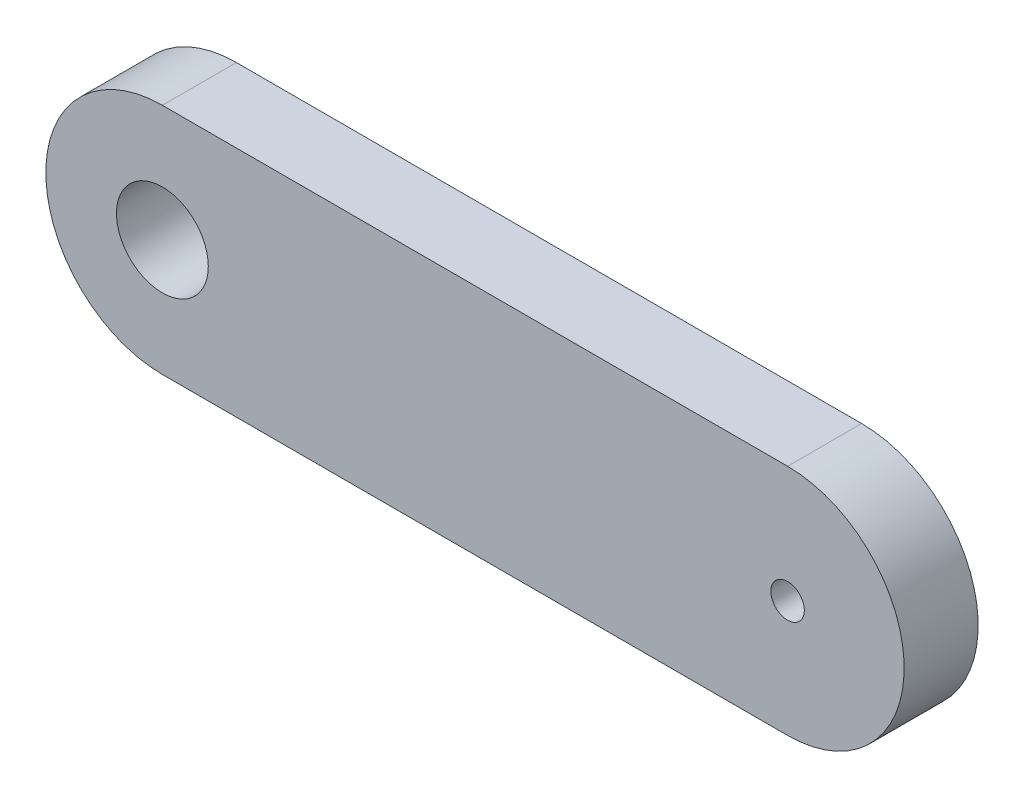
ISO-10303-21;
HEADER;
FILE_DESCRIPTION(('STEP AP214'),'2;1');
FILE_NAME('part.step','',(''),(''),'','','');
FILE_SCHEMA(('AUTOMOTIVE_DESIGN { 1 0 10303 214 1 1 1 1 }'));
ENDSEC;
DATA;
#1=APPLICATION_CONTEXT('core data for automotive mechanical design processes');
#2=APPLICATION_PROTOCOL_DEFINITION('international standard','automotive_design',2000,#1);
#3=PRODUCT_CONTEXT('',#1,'mechanical');
#4=PRODUCT('Part','Part','',(#3));
#5=PRODUCT_RELATED_PRODUCT_CATEGORY('part','',(#4));
#6=PRODUCT_DEFINITION_FORMATION('','',#4);
#7=PRODUCT_DEFINITION_CONTEXT('part definition',#1,'design');
#8=PRODUCT_DEFINITION('design','',#6,#7);
#9=PRODUCT_DEFINITION_SHAPE('','',#8);
#10=(LENGTH_UNIT() NAMED_UNIT(*) SI_UNIT(.MILLI.,.METRE.));
#11=(NAMED_UNIT(*) PLANE_ANGLE_UNIT() SI_UNIT($,.RADIAN.));
#12=(NAMED_UNIT(*) SI_UNIT($,.STERADIAN.) SOLID_ANGLE_UNIT());
#13=UNCERTAINTY_MEASURE_WITH_UNIT(LENGTH_MEASURE(1.E-05),#10,'distance_accuracy_value','');
#14=(GEOMETRIC_REPRESENTATION_CONTEXT(3) GLOBAL_UNCERTAINTY_ASSIGNED_CONTEXT((#13)) GLOBAL_UNIT_ASSIGNED_CONTEXT((#10,
#11,#12)) REPRESENTATION_CONTEXT('',''));
#15=CARTESIAN_POINT('',(0.,0.,0.));
#16=DIRECTION('',(0.,0.,1.));
#17=DIRECTION('',(1.,0.,0.));
#18=AXIS2_PLACEMENT_3D('',#15,#16,#17);
#19=CARTESIAN_POINT('',(-26.81729841,0.,6.35));
#20=DIRECTION('',(0.,0.,1.));
#21=DIRECTION('',(1.,0.,0.));
#22=AXIS2_PLACEMENT_3D('',#19,#20,#21);
#23=PLANE('',#22);
#24=CARTESIAN_POINT('',(-26.81729841,0.,6.35));
#25=DIRECTION('',(0.,0.,1.));
#26=DIRECTION('',(1.,0.,0.));
#27=AXIS2_PLACEMENT_3D('',#24,#25,#26);
#28=CIRCLE('',#27,3.9375);
#29=CARTESIAN_POINT('',(-22.87979841,0.,6.35));
#30=VERTEX_POINT('',#29);
#31=EDGE_CURVE('E125',#30,#30,#28,.T.);
#32=ORIENTED_EDGE('',*,*,#31,.F.);
#33=EDGE_LOOP('',(#32));
#34=FACE_BOUND('',#33,.T.);
#35=CARTESIAN_POINT('',(-26.81729841,0.,6.35));
#36=DIRECTION('',(0.,0.,1.));
#37=DIRECTION('',(1.,0.,0.));
#38=AXIS2_PLACEMENT_3D('',#35,#36,#37);
#39=CIRCLE('',#38,10.);
#40=CARTESIAN_POINT('',(-26.81729841,10.,6.35));
#41=VERTEX_POINT('',#40);
#42=CARTESIAN_POINT('',(-26.81729841,-10.,6.35));
#43=VERTEX_POINT('',#42);
#44=EDGE_CURVE('E99',#41,#43,#39,.T.);
#45=ORIENTED_EDGE('',*,*,#44,.T.);
#46=DIRECTION('',(1.,0.,0.));
#47=VECTOR('',#46,1.);
#48=CARTESIAN_POINT('',(-26.81729841,-10.,6.35));
#49=LINE('',#48,#47);
#50=CARTESIAN_POINT('',(26.81729841,-9.99999999999999,6.35));
#51=VERTEX_POINT('',#50);
#52=EDGE_CURVE('E93',#43,#51,#49,.T.);
#53=ORIENTED_EDGE('',*,*,#52,.T.);
#54=CARTESIAN_POINT('',(26.81729841,0.,6.35));
#55=DIRECTION('',(0.,0.,1.));
#56=DIRECTION('',(1.,0.,0.));
#57=AXIS2_PLACEMENT_3D('',#54,#55,#56);
#58=CIRCLE('',#57,10.);
#59=CARTESIAN_POINT('',(26.81729841,10.,6.35));
#60=VERTEX_POINT('',#59);
#61=EDGE_CURVE('E96',#51,#60,#58,.T.);
#62=ORIENTED_EDGE('',*,*,#61,.T.);
#63=DIRECTION('',(-1.,0.,0.));
#64=VECTOR('',#63,1.);
#65=CARTESIAN_POINT('',(-26.81729841,10.,6.35));
#66=LINE('',#65,#64);
#67=EDGE_CURVE('E64',#60,#41,#66,.T.);
#68=ORIENTED_EDGE('',*,*,#67,.T.);
#69=EDGE_LOOP('',(#45,#53,#62,#68));
#70=FACE_BOUND('',#69,.T.);
#71=CARTESIAN_POINT('',(26.81729841,0.,6.35));
#72=DIRECTION('',(0.,0.,1.));
#73=DIRECTION('',(1.,0.,0.));
#74=AXIS2_PLACEMENT_3D('',#71,#72,#73);
#75=CIRCLE('',#74,1.4375);
#76=CARTESIAN_POINT('',(28.25479841,0.,6.35));
#77=VERTEX_POINT('',#76);
#78=EDGE_CURVE('E147',#77,#77,#75,.T.);
#79=ORIENTED_EDGE('',*,*,#78,.F.);
#80=EDGE_LOOP('',(#79));
#81=FACE_BOUND('',#80,.T.);
#82=ADVANCED_FACE('F50',(#34,#70,#81),#23,.T.);
#83=CARTESIAN_POINT('',(-26.81729841,0.,0.));
#84=DIRECTION('',(0.,0.,1.));
#85=DIRECTION('',(1.,0.,0.));
#86=AXIS2_PLACEMENT_3D('',#83,#84,#85);
#87=PLANE('',#86);
#88=CARTESIAN_POINT('',(-26.81729841,0.,0.));
#89=DIRECTION('',(0.,0.,1.));
#90=DIRECTION('',(1.,0.,0.));
#91=AXIS2_PLACEMENT_3D('',#88,#89,#90);
#92=CIRCLE('',#91,10.);
#93=CARTESIAN_POINT('',(-26.81729841,10.,0.));
#94=VERTEX_POINT('',#93);
#95=CARTESIAN_POINT('',(-26.81729841,-10.,0.));
#96=VERTEX_POINT('',#95);
#97=EDGE_CURVE('E117',#94,#96,#92,.T.);
#98=ORIENTED_EDGE('',*,*,#97,.F.);
#99=DIRECTION('',(-1.,0.,0.));
#100=VECTOR('',#99,1.);
#101=CARTESIAN_POINT('',(-26.81729841,10.,0.));
#102=LINE('',#101,#100);
#103=CARTESIAN_POINT('',(26.81729841,10.,0.));
#104=VERTEX_POINT('',#103);
#105=EDGE_CURVE('E88',#104,#94,#102,.T.);
#106=ORIENTED_EDGE('',*,*,#105,.F.);
#107=CARTESIAN_POINT('',(26.81729841,0.,0.));
#108=DIRECTION('',(0.,0.,1.));
#109=DIRECTION('',(1.,0.,0.));
#110=AXIS2_PLACEMENT_3D('',#107,#108,#109);
#111=CIRCLE('',#110,10.);
#112=CARTESIAN_POINT('',(26.81729841,-9.99999999999999,0.));
#113=VERTEX_POINT('',#112);
#114=EDGE_CURVE('E85',#113,#104,#111,.T.);
#115=ORIENTED_EDGE('',*,*,#114,.F.);
#116=DIRECTION('',(1.,0.,0.));
#117=VECTOR('',#116,1.);
#118=CARTESIAN_POINT('',(-26.81729841,-10.,0.));
#119=LINE('',#118,#117);
#120=EDGE_CURVE('E102',#96,#113,#119,.T.);
#121=ORIENTED_EDGE('',*,*,#120,.F.);
#122=EDGE_LOOP('',(#98,#106,#115,#121));
#123=FACE_BOUND('',#122,.T.);
#124=CARTESIAN_POINT('',(-26.81729841,0.,0.));
#125=DIRECTION('',(0.,0.,1.));
#126=DIRECTION('',(1.,0.,0.));
#127=AXIS2_PLACEMENT_3D('',#124,#125,#126);
#128=CIRCLE('',#127,3.9375);
#129=CARTESIAN_POINT('',(-22.87979841,0.,0.));
#130=VERTEX_POINT('',#129);
#131=EDGE_CURVE('E144',#130,#130,#128,.T.);
#132=ORIENTED_EDGE('',*,*,#131,.T.);
#133=EDGE_LOOP('',(#132));
#134=FACE_BOUND('',#133,.T.);
#135=CARTESIAN_POINT('',(26.81729841,0.,0.));
#136=DIRECTION('',(0.,0.,1.));
#137=DIRECTION('',(1.,0.,0.));
#138=AXIS2_PLACEMENT_3D('',#135,#136,#137);
#139=CIRCLE('',#138,1.4375);
#140=CARTESIAN_POINT('',(28.25479841,0.,0.));
#141=VERTEX_POINT('',#140);
#142=EDGE_CURVE('E155',#141,#141,#139,.T.);
#143=ORIENTED_EDGE('',*,*,#142,.T.);
#144=EDGE_LOOP('',(#143));
#145=FACE_BOUND('',#144,.T.);
#146=ADVANCED_FACE('F140',(#123,#134,#145),#87,.F.);
#147=CARTESIAN_POINT('',(-26.81729841,0.,6.35));
#148=DIRECTION('',(0.,0.,-1.));
#149=DIRECTION('',(-1.,0.,0.));
#150=AXIS2_PLACEMENT_3D('',#147,#148,#149);
#151=CYLINDRICAL_SURFACE('',#150,10.);
#152=ORIENTED_EDGE('',*,*,#97,.T.);
#153=DIRECTION('',(0.,0.,-1.));
#154=VECTOR('',#153,1.);
#155=CARTESIAN_POINT('',(-26.81729841,-10.,6.35));
#156=LINE('',#155,#154);
#157=EDGE_CURVE('E11',#43,#96,#156,.T.);
#158=ORIENTED_EDGE('',*,*,#157,.F.);
#159=ORIENTED_EDGE('',*,*,#44,.F.);
#160=DIRECTION('',(0.,0.,-1.));
#161=VECTOR('',#160,1.);
#162=CARTESIAN_POINT('',(-26.81729841,10.,6.35));
#163=LINE('',#162,#161);
#164=EDGE_CURVE('E112',#41,#94,#163,.T.);
#165=ORIENTED_EDGE('',*,*,#164,.T.);
#166=EDGE_LOOP('',(#152,#158,#159,#165));
#167=FACE_BOUND('',#166,.T.);
#168=ADVANCED_FACE('F47',(#167),#151,.T.);
#169=CARTESIAN_POINT('',(-26.81729841,-10.,6.35));
#170=DIRECTION('',(0.,1.,0.));
#171=DIRECTION('',(-1.,0.,0.));
#172=AXIS2_PLACEMENT_3D('',#169,#170,#171);
#173=PLANE('',#172);
#174=ORIENTED_EDGE('',*,*,#120,.T.);
#175=DIRECTION('',(0.,0.,-1.));
#176=VECTOR('',#175,1.);
#177=CARTESIAN_POINT('',(26.81729841,-9.99999999999999,6.35));
#178=LINE('',#177,#176);
#179=EDGE_CURVE('E60',#51,#113,#178,.T.);
#180=ORIENTED_EDGE('',*,*,#179,.F.);
#181=ORIENTED_EDGE('',*,*,#52,.F.);
#182=ORIENTED_EDGE('',*,*,#157,.T.);
#183=EDGE_LOOP('',(#174,#180,#181,#182));
#184=FACE_BOUND('',#183,.T.);
#185=ADVANCED_FACE('F104',(#184),#173,.F.);
#186=CARTESIAN_POINT('',(26.81729841,0.,6.35));
#187=DIRECTION('',(0.,0.,-1.));
#188=DIRECTION('',(-1.,0.,0.));
#189=AXIS2_PLACEMENT_3D('',#186,#187,#188);
#190=CYLINDRICAL_SURFACE('',#189,10.);
#191=ORIENTED_EDGE('',*,*,#114,.T.);
#192=DIRECTION('',(0.,0.,-1.));
#193=VECTOR('',#192,1.);
#194=CARTESIAN_POINT('',(26.81729841,10.,6.35));
#195=LINE('',#194,#193);
#196=EDGE_CURVE('E110',#60,#104,#195,.T.);
#197=ORIENTED_EDGE('',*,*,#196,.F.);
#198=ORIENTED_EDGE('',*,*,#61,.F.);
#199=ORIENTED_EDGE('',*,*,#179,.T.);
#200=EDGE_LOOP('',(#191,#197,#198,#199));
#201=FACE_BOUND('',#200,.T.);
#202=ADVANCED_FACE('F108',(#201),#190,.T.);
#203=CARTESIAN_POINT('',(-26.81729841,10.,6.35));
#204=DIRECTION('',(0.,-1.,0.));
#205=DIRECTION('',(1.,0.,0.));
#206=AXIS2_PLACEMENT_3D('',#203,#204,#205);
#207=PLANE('',#206);
#208=ORIENTED_EDGE('',*,*,#105,.T.);
#209=ORIENTED_EDGE('',*,*,#164,.F.);
#210=ORIENTED_EDGE('',*,*,#67,.F.);
#211=ORIENTED_EDGE('',*,*,#196,.T.);
#212=EDGE_LOOP('',(#208,#209,#210,#211));
#213=FACE_BOUND('',#212,.T.);
#214=ADVANCED_FACE('F132',(#213),#207,.F.);
#215=CARTESIAN_POINT('',(-26.81729841,0.,6.35));
#216=DIRECTION('',(0.,0.,-1.));
#217=DIRECTION('',(-1.,0.,0.));
#218=AXIS2_PLACEMENT_3D('',#215,#216,#217);
#219=CYLINDRICAL_SURFACE('',#218,3.9375);
#220=ORIENTED_EDGE('',*,*,#31,.T.);
#221=EDGE_LOOP('',(#220));
#222=FACE_BOUND('',#221,.T.);
#223=ORIENTED_EDGE('',*,*,#131,.F.);
#224=EDGE_LOOP('',(#223));
#225=FACE_BOUND('',#224,.T.);
#226=ADVANCED_FACE('F173',(#222,#225),#219,.F.);
#227=CARTESIAN_POINT('',(26.81729841,0.,6.35));
#228=DIRECTION('',(0.,0.,-1.));
#229=DIRECTION('',(-1.,0.,0.));
#230=AXIS2_PLACEMENT_3D('',#227,#228,#229);
#231=CYLINDRICAL_SURFACE('',#230,1.4375);
#232=ORIENTED_EDGE('',*,*,#78,.T.);
#233=EDGE_LOOP('',(#232));
#234=FACE_BOUND('',#233,.T.);
#235=ORIENTED_EDGE('',*,*,#142,.F.);
#236=EDGE_LOOP('',(#235));
#237=FACE_BOUND('',#236,.T.);
#238=ADVANCED_FACE('F162',(#234,#237),#231,.F.);
#239=CLOSED_SHELL('',(#82,#146,#168,#185,#202,#214,#226,#238));
#240=MANIFOLD_SOLID_BREP('B2',#239);
#241=ADVANCED_BREP_SHAPE_REPRESENTATION('',(#18,#240),#14);
#242=SHAPE_DEFINITION_REPRESENTATION(#9,#241);
ENDSEC;
END-ISO-10303-21;
